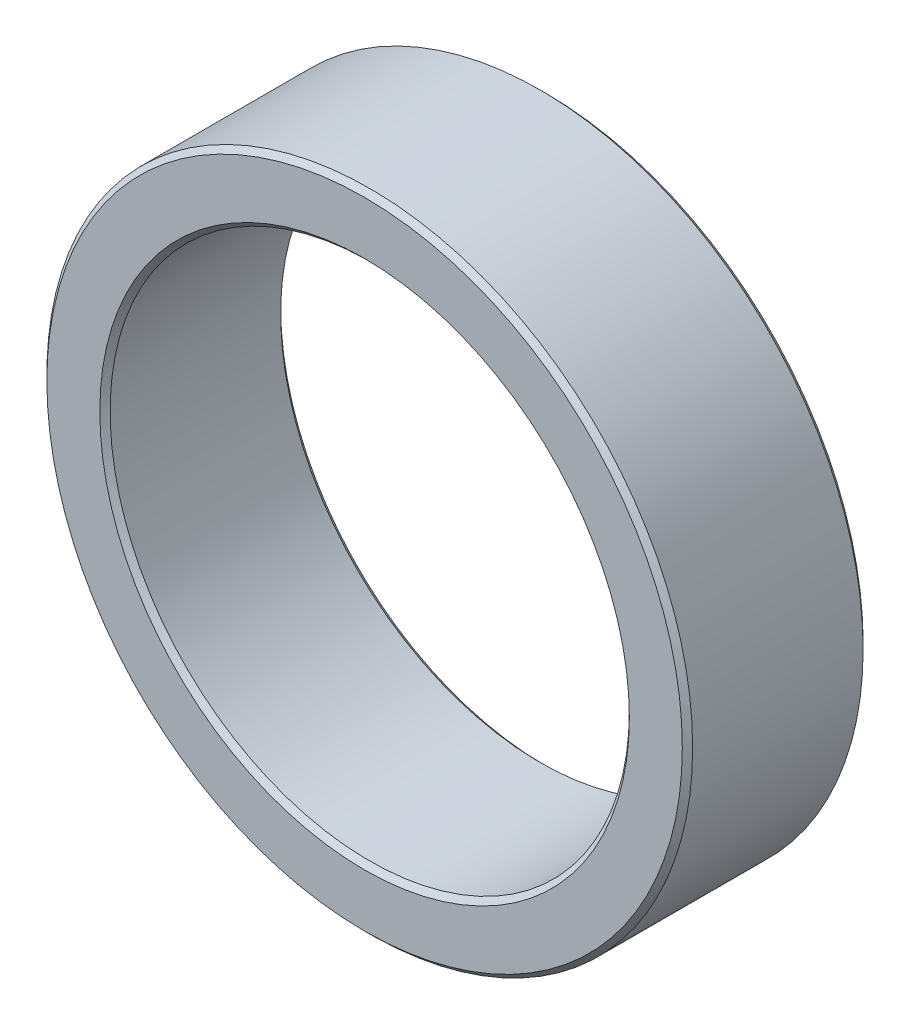
ISO-10303-21;
HEADER;
FILE_DESCRIPTION(('STEP AP214'),'2;1');
FILE_NAME('part.step','',(''),(''),'','','');
FILE_SCHEMA(('AUTOMOTIVE_DESIGN { 1 0 10303 214 1 1 1 1 }'));
ENDSEC;
DATA;
#1=APPLICATION_CONTEXT('core data for automotive mechanical design processes');
#2=APPLICATION_PROTOCOL_DEFINITION('international standard','automotive_design',2000,#1);
#3=PRODUCT_CONTEXT('',#1,'mechanical');
#4=PRODUCT('Part','Part','',(#3));
#5=PRODUCT_RELATED_PRODUCT_CATEGORY('part','',(#4));
#6=PRODUCT_DEFINITION_FORMATION('','',#4);
#7=PRODUCT_DEFINITION_CONTEXT('part definition',#1,'design');
#8=PRODUCT_DEFINITION('design','',#6,#7);
#9=PRODUCT_DEFINITION_SHAPE('','',#8);
#10=(LENGTH_UNIT() NAMED_UNIT(*) SI_UNIT(.MILLI.,.METRE.));
#11=(NAMED_UNIT(*) PLANE_ANGLE_UNIT() SI_UNIT($,.RADIAN.));
#12=(NAMED_UNIT(*) SI_UNIT($,.STERADIAN.) SOLID_ANGLE_UNIT());
#13=UNCERTAINTY_MEASURE_WITH_UNIT(LENGTH_MEASURE(1.E-05),#10,'distance_accuracy_value','');
#14=(GEOMETRIC_REPRESENTATION_CONTEXT(3) GLOBAL_UNCERTAINTY_ASSIGNED_CONTEXT((#13)) GLOBAL_UNIT_ASSIGNED_CONTEXT((#10,
#11,#12)) REPRESENTATION_CONTEXT('',''));
#15=CARTESIAN_POINT('',(0.,0.,0.));
#16=DIRECTION('',(0.,0.,1.));
#17=DIRECTION('',(1.,0.,0.));
#18=AXIS2_PLACEMENT_3D('',#15,#16,#17);
#19=CARTESIAN_POINT('',(0.,0.,7.));
#20=DIRECTION('',(0.,0.,1.));
#21=DIRECTION('',(1.,0.,0.));
#22=AXIS2_PLACEMENT_3D('',#19,#20,#21);
#23=PLANE('',#22);
#24=CARTESIAN_POINT('',(0.,0.,7.));
#25=DIRECTION('',(0.,0.,1.));
#26=DIRECTION('',(1.,0.,0.));
#27=AXIS2_PLACEMENT_3D('',#24,#25,#26);
#28=CIRCLE('',#27,12.3);
#29=CARTESIAN_POINT('',(12.3,0.,7.));
#30=VERTEX_POINT('',#29);
#31=EDGE_CURVE('E51',#30,#30,#28,.T.);
#32=ORIENTED_EDGE('',*,*,#31,.T.);
#33=EDGE_LOOP('',(#32));
#34=FACE_BOUND('',#33,.T.);
#35=CARTESIAN_POINT('',(0.,0.,7.));
#36=DIRECTION('',(0.,0.,1.));
#37=DIRECTION('',(1.,0.,0.));
#38=AXIS2_PLACEMENT_3D('',#35,#36,#37);
#39=CIRCLE('',#38,10.25);
#40=CARTESIAN_POINT('',(10.25,0.,7.));
#41=VERTEX_POINT('',#40);
#42=EDGE_CURVE('E55',#41,#41,#39,.F.);
#43=ORIENTED_EDGE('',*,*,#42,.T.);
#44=EDGE_LOOP('',(#43));
#45=FACE_BOUND('',#44,.T.);
#46=ADVANCED_FACE('F39',(#34,#45),#23,.T.);
#47=CARTESIAN_POINT('',(0.,0.,0.));
#48=DIRECTION('',(0.,0.,1.));
#49=DIRECTION('',(1.,0.,0.));
#50=AXIS2_PLACEMENT_3D('',#47,#48,#49);
#51=PLANE('',#50);
#52=CARTESIAN_POINT('',(0.,0.,0.));
#53=DIRECTION('',(0.,0.,1.));
#54=DIRECTION('',(1.,0.,0.));
#55=AXIS2_PLACEMENT_3D('',#52,#53,#54);
#56=CIRCLE('',#55,12.3);
#57=CARTESIAN_POINT('',(12.3,0.,0.));
#58=VERTEX_POINT('',#57);
#59=EDGE_CURVE('E60',#58,#58,#56,.F.);
#60=ORIENTED_EDGE('',*,*,#59,.T.);
#61=EDGE_LOOP('',(#60));
#62=FACE_BOUND('',#61,.T.);
#63=CARTESIAN_POINT('',(0.,0.,0.));
#64=DIRECTION('',(0.,0.,1.));
#65=DIRECTION('',(1.,0.,0.));
#66=AXIS2_PLACEMENT_3D('',#63,#64,#65);
#67=CIRCLE('',#66,10.25);
#68=CARTESIAN_POINT('',(10.25,0.,0.));
#69=VERTEX_POINT('',#68);
#70=EDGE_CURVE('E63',#69,#69,#67,.T.);
#71=ORIENTED_EDGE('',*,*,#70,.T.);
#72=EDGE_LOOP('',(#71));
#73=FACE_BOUND('',#72,.T.);
#74=ADVANCED_FACE('F85',(#62,#73),#51,.F.);
#75=CARTESIAN_POINT('',(0.,0.,7.));
#76=DIRECTION('',(0.,0.,-1.));
#77=DIRECTION('',(-1.,0.,0.));
#78=AXIS2_PLACEMENT_3D('',#75,#76,#77);
#79=CYLINDRICAL_SURFACE('',#78,12.5);
#80=CARTESIAN_POINT('',(0.,0.,0.199999999999997));
#81=DIRECTION('',(0.,0.,1.));
#82=DIRECTION('',(1.,0.,0.));
#83=AXIS2_PLACEMENT_3D('',#80,#81,#82);
#84=CIRCLE('',#83,12.5);
#85=CARTESIAN_POINT('',(12.5,0.,0.199999999999997));
#86=VERTEX_POINT('',#85);
#87=EDGE_CURVE('E66',#86,#86,#84,.T.);
#88=ORIENTED_EDGE('',*,*,#87,.T.);
#89=EDGE_LOOP('',(#88));
#90=FACE_BOUND('',#89,.T.);
#91=CARTESIAN_POINT('',(0.,0.,6.8));
#92=DIRECTION('',(0.,0.,1.));
#93=DIRECTION('',(1.,0.,0.));
#94=AXIS2_PLACEMENT_3D('',#91,#92,#93);
#95=CIRCLE('',#94,12.5);
#96=CARTESIAN_POINT('',(12.5,0.,6.8));
#97=VERTEX_POINT('',#96);
#98=EDGE_CURVE('E69',#97,#97,#95,.F.);
#99=ORIENTED_EDGE('',*,*,#98,.T.);
#100=EDGE_LOOP('',(#99));
#101=FACE_BOUND('',#100,.T.);
#102=ADVANCED_FACE('F73',(#90,#101),#79,.T.);
#103=CARTESIAN_POINT('',(0.,0.,7.));
#104=DIRECTION('',(0.,0.,-1.));
#105=DIRECTION('',(-1.,0.,0.));
#106=AXIS2_PLACEMENT_3D('',#103,#104,#105);
#107=CYLINDRICAL_SURFACE('',#106,10.05);
#108=CARTESIAN_POINT('',(0.,0.,0.199999999999992));
#109=DIRECTION('',(0.,0.,1.));
#110=DIRECTION('',(1.,0.,0.));
#111=AXIS2_PLACEMENT_3D('',#108,#109,#110);
#112=CIRCLE('',#111,10.05);
#113=CARTESIAN_POINT('',(10.05,0.,0.199999999999992));
#114=VERTEX_POINT('',#113);
#115=EDGE_CURVE('E10',#114,#114,#112,.F.);
#116=ORIENTED_EDGE('',*,*,#115,.T.);
#117=EDGE_LOOP('',(#116));
#118=FACE_BOUND('',#117,.T.);
#119=CARTESIAN_POINT('',(0.,0.,6.80000000000001));
#120=DIRECTION('',(0.,0.,1.));
#121=DIRECTION('',(1.,0.,0.));
#122=AXIS2_PLACEMENT_3D('',#119,#120,#121);
#123=CIRCLE('',#122,10.05);
#124=CARTESIAN_POINT('',(10.05,0.,6.80000000000001));
#125=VERTEX_POINT('',#124);
#126=EDGE_CURVE('E47',#125,#125,#123,.T.);
#127=ORIENTED_EDGE('',*,*,#126,.T.);
#128=EDGE_LOOP('',(#127));
#129=FACE_BOUND('',#128,.T.);
#130=ADVANCED_FACE('F110',(#118,#129),#107,.F.);
#131=CARTESIAN_POINT('',(0.,0.,0.199999999999997));
#132=DIRECTION('',(0.,0.,1.));
#133=DIRECTION('',(1.,0.,0.));
#134=AXIS2_PLACEMENT_3D('',#131,#132,#133);
#135=CONICAL_SURFACE('',#134,12.5,0.785398163397444);
#136=ORIENTED_EDGE('',*,*,#59,.F.);
#137=EDGE_LOOP('',(#136));
#138=FACE_BOUND('',#137,.T.);
#139=ORIENTED_EDGE('',*,*,#87,.F.);
#140=EDGE_LOOP('',(#139));
#141=FACE_BOUND('',#140,.T.);
#142=ADVANCED_FACE('F79',(#138,#141),#135,.T.);
#143=CARTESIAN_POINT('',(0.,0.,7.));
#144=DIRECTION('',(0.,0.,-1.));
#145=DIRECTION('',(-1.,0.,0.));
#146=AXIS2_PLACEMENT_3D('',#143,#144,#145);
#147=CONICAL_SURFACE('',#146,12.3,0.785398163397453);
#148=ORIENTED_EDGE('',*,*,#98,.F.);
#149=EDGE_LOOP('',(#148));
#150=FACE_BOUND('',#149,.T.);
#151=ORIENTED_EDGE('',*,*,#31,.F.);
#152=EDGE_LOOP('',(#151));
#153=FACE_BOUND('',#152,.T.);
#154=ADVANCED_FACE('F75',(#150,#153),#147,.T.);
#155=CARTESIAN_POINT('',(0.,0.,0.));
#156=DIRECTION('',(0.,0.,-1.));
#157=DIRECTION('',(-1.,0.,0.));
#158=AXIS2_PLACEMENT_3D('',#155,#156,#157);
#159=CONICAL_SURFACE('',#158,10.25,0.785398163397457);
#160=ORIENTED_EDGE('',*,*,#115,.F.);
#161=EDGE_LOOP('',(#160));
#162=FACE_BOUND('',#161,.T.);
#163=ORIENTED_EDGE('',*,*,#70,.F.);
#164=EDGE_LOOP('',(#163));
#165=FACE_BOUND('',#164,.T.);
#166=ADVANCED_FACE('F78',(#162,#165),#159,.F.);
#167=CARTESIAN_POINT('',(0.,0.,6.80000000000001));
#168=DIRECTION('',(0.,0.,1.));
#169=DIRECTION('',(1.,0.,0.));
#170=AXIS2_PLACEMENT_3D('',#167,#168,#169);
#171=CONICAL_SURFACE('',#170,10.05,0.785398163397461);
#172=CARTESIAN_POINT('',(10.25,0.,7.));
#173=CARTESIAN_POINT('',(10.2479166666667,0.,6.99791666666667));
#174=CARTESIAN_POINT('',(10.2458333333333,0.,6.99583333333333));
#175=CARTESIAN_POINT('',(10.2416666666667,0.,6.99166666666667));
#176=CARTESIAN_POINT('',(10.2395833333333,0.,6.98958333333333));
#177=CARTESIAN_POINT('',(10.2354166666667,0.,6.98541666666667));
#178=CARTESIAN_POINT('',(10.2333333333333,0.,6.98333333333333));
#179=CARTESIAN_POINT('',(10.2291666666667,0.,6.97916666666667));
#180=CARTESIAN_POINT('',(10.2270833333333,0.,6.97708333333333));
#181=CARTESIAN_POINT('',(10.2229166666667,0.,6.97291666666667));
#182=CARTESIAN_POINT('',(10.2208333333333,0.,6.97083333333333));
#183=CARTESIAN_POINT('',(10.2166666666667,0.,6.96666666666667));
#184=CARTESIAN_POINT('',(10.2145833333333,0.,6.96458333333333));
#185=CARTESIAN_POINT('',(10.2104166666667,0.,6.96041666666667));
#186=CARTESIAN_POINT('',(10.2083333333333,0.,6.95833333333333));
#187=CARTESIAN_POINT('',(10.2041666666667,0.,6.95416666666667));
#188=CARTESIAN_POINT('',(10.2020833333333,0.,6.95208333333333));
#189=CARTESIAN_POINT('',(10.1979166666667,0.,6.94791666666667));
#190=CARTESIAN_POINT('',(10.1958333333333,0.,6.94583333333333));
#191=CARTESIAN_POINT('',(10.1916666666667,0.,6.94166666666667));
#192=CARTESIAN_POINT('',(10.1895833333333,0.,6.93958333333333));
#193=CARTESIAN_POINT('',(10.1854166666667,0.,6.93541666666667));
#194=CARTESIAN_POINT('',(10.1833333333333,0.,6.93333333333333));
#195=CARTESIAN_POINT('',(10.1791666666667,0.,6.92916666666667));
#196=CARTESIAN_POINT('',(10.1770833333333,0.,6.92708333333334));
#197=CARTESIAN_POINT('',(10.1729166666667,0.,6.92291666666667));
#198=CARTESIAN_POINT('',(10.1708333333333,0.,6.92083333333334));
#199=CARTESIAN_POINT('',(10.1666666666667,0.,6.91666666666667));
#200=CARTESIAN_POINT('',(10.1645833333333,0.,6.91458333333334));
#201=CARTESIAN_POINT('',(10.1604166666667,0.,6.91041666666667));
#202=CARTESIAN_POINT('',(10.1583333333333,0.,6.90833333333334));
#203=CARTESIAN_POINT('',(10.1541666666667,0.,6.90416666666667));
#204=CARTESIAN_POINT('',(10.1520833333333,0.,6.90208333333334));
#205=CARTESIAN_POINT('',(10.1479166666667,0.,6.89791666666667));
#206=CARTESIAN_POINT('',(10.1458333333333,0.,6.89583333333334));
#207=CARTESIAN_POINT('',(10.1416666666667,0.,6.89166666666667));
#208=CARTESIAN_POINT('',(10.1395833333333,0.,6.88958333333334));
#209=CARTESIAN_POINT('',(10.1354166666667,0.,6.88541666666667));
#210=CARTESIAN_POINT('',(10.1333333333333,0.,6.88333333333334));
#211=CARTESIAN_POINT('',(10.1291666666667,0.,6.87916666666667));
#212=CARTESIAN_POINT('',(10.1270833333333,0.,6.87708333333334));
#213=CARTESIAN_POINT('',(10.1229166666667,0.,6.87291666666667));
#214=CARTESIAN_POINT('',(10.1208333333333,0.,6.87083333333334));
#215=CARTESIAN_POINT('',(10.1166666666667,0.,6.86666666666667));
#216=CARTESIAN_POINT('',(10.1145833333333,0.,6.86458333333334));
#217=CARTESIAN_POINT('',(10.1104166666667,0.,6.86041666666667));
#218=CARTESIAN_POINT('',(10.1083333333333,0.,6.85833333333334));
#219=CARTESIAN_POINT('',(10.1041666666667,0.,6.85416666666667));
#220=CARTESIAN_POINT('',(10.1020833333333,0.,6.85208333333334));
#221=CARTESIAN_POINT('',(10.0979166666667,0.,6.84791666666667));
#222=CARTESIAN_POINT('',(10.0958333333333,0.,6.84583333333334));
#223=CARTESIAN_POINT('',(10.0916666666667,0.,6.84166666666667));
#224=CARTESIAN_POINT('',(10.0895833333333,0.,6.83958333333334));
#225=CARTESIAN_POINT('',(10.0854166666667,0.,6.83541666666667));
#226=CARTESIAN_POINT('',(10.0833333333333,0.,6.83333333333334));
#227=CARTESIAN_POINT('',(10.0791666666667,0.,6.82916666666667));
#228=CARTESIAN_POINT('',(10.0770833333333,0.,6.82708333333334));
#229=CARTESIAN_POINT('',(10.0729166666667,0.,6.82291666666667));
#230=CARTESIAN_POINT('',(10.0708333333333,0.,6.82083333333334));
#231=CARTESIAN_POINT('',(10.0666666666667,0.,6.81666666666667));
#232=CARTESIAN_POINT('',(10.0645833333333,0.,6.81458333333334));
#233=CARTESIAN_POINT('',(10.0604166666667,0.,6.81041666666667));
#234=CARTESIAN_POINT('',(10.0583333333333,0.,6.80833333333334));
#235=CARTESIAN_POINT('',(10.0541666666667,0.,6.80416666666667));
#236=CARTESIAN_POINT('',(10.0520833333333,0.,6.80208333333334));
#237=CARTESIAN_POINT('',(10.05,0.,6.80000000000001));
#238=B_SPLINE_CURVE_WITH_KNOTS('',3,(#172,#173,#174,#175,#176,#177,#178,#179,#180,#181,#182,
#183,#184,#185,#186,#187,#188,#189,#190,#191,#192,#193,#194,#195,#196,#197,#198,#199,#200,#201,
#202,#203,#204,#205,#206,#207,#208,#209,#210,#211,#212,#213,#214,#215,#216,#217,#218,#219,#220,
#221,#222,#223,#224,#225,#226,#227,#228,#229,#230,#231,#232,#233,#234,#235,#236,#237),
.UNSPECIFIED.,.F.,.F.,(4,2,2,2,2,2,2,2,2,2,2,2,2,2,2,2,2,2,2,2,2,2,2,2,2,2,2,2,2,2,2,2,4),(0.,
0.00883883476483271,0.0176776695296642,0.0265165042944951,0.0353553390593278,0.0441941738241586,
0.0530330085889901,0.0618718433538222,0.0707106781186537,0.0795495128834864,0.0883883476483173,
0.0972271824131488,0.106066017177981,0.114904851942812,0.123743686707643,0.132582521472476,
0.141421356237307,0.15026019100214,0.159099025766971,0.167937860531802,0.176776695296635,
0.185615530061466,0.194454364826297,0.203293199591129,0.212132034355961,0.220970869120793,
0.229809703885624,0.238648538650456,0.247487373415288,0.256326208180119,0.265165042944951,
0.274003877709783,0.282842712474614),.UNSPECIFIED.);
#239=EDGE_CURVE('BSEAM42',#41,#125,#238,.T.);
#240=ORIENTED_EDGE('',*,*,#42,.F.);
#241=ORIENTED_EDGE('',*,*,#126,.F.);
#242=ORIENTED_EDGE('',*,*,#239,.T.);
#243=ORIENTED_EDGE('',*,*,#239,.F.);
#244=EDGE_LOOP('',(#240,#242,#241,#243));
#245=FACE_BOUND('',#244,.T.);
#246=ADVANCED_FACE('F42',(#245),#171,.F.);
#247=CLOSED_SHELL('',(#46,#74,#102,#130,#142,#154,#166,#246));
#248=MANIFOLD_SOLID_BREP('B2',#247);
#249=ADVANCED_BREP_SHAPE_REPRESENTATION('',(#18,#248),#14);
#250=SHAPE_DEFINITION_REPRESENTATION(#9,#249);
ENDSEC;
END-ISO-10303-21;
